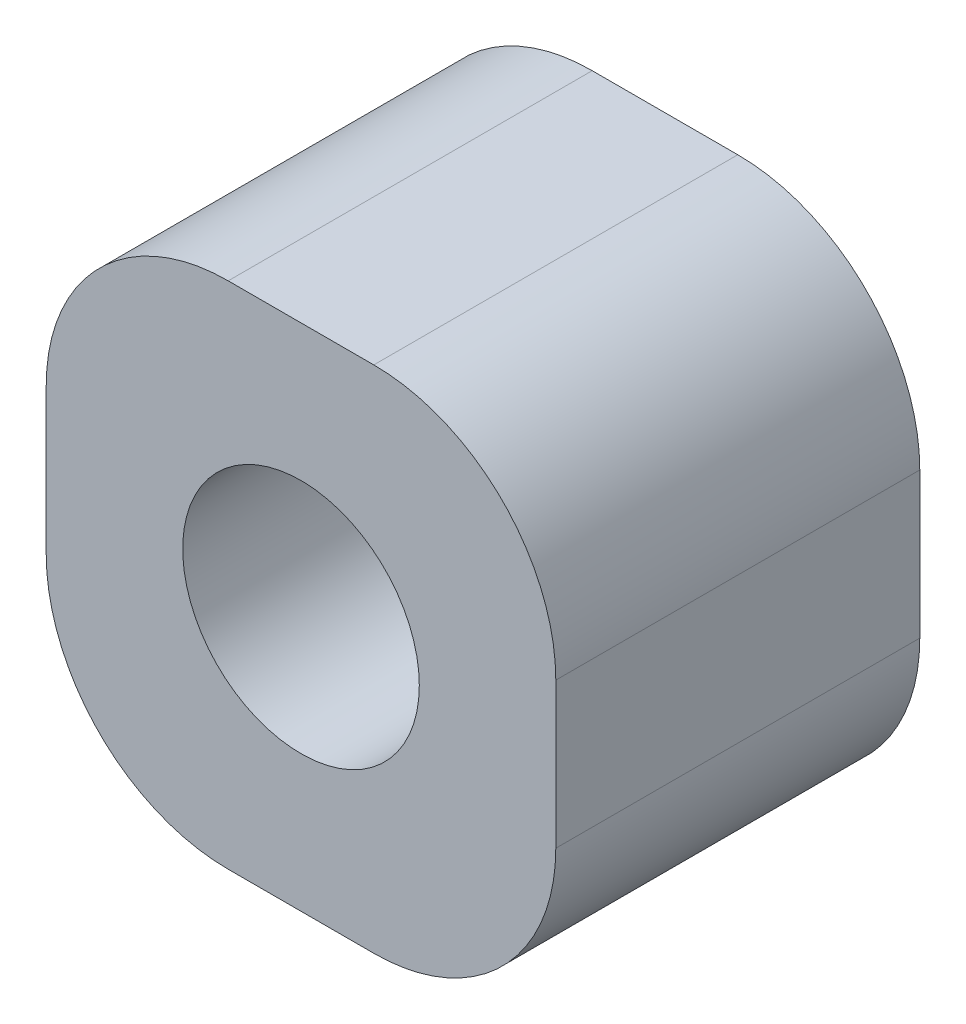
ISO-10303-21;
HEADER;
FILE_DESCRIPTION(('STEP AP214'),'2;1');
FILE_NAME('part.step','',(''),(''),'','','');
FILE_SCHEMA(('AUTOMOTIVE_DESIGN { 1 0 10303 214 1 1 1 1 }'));
ENDSEC;
DATA;
#1=APPLICATION_CONTEXT('core data for automotive mechanical design processes');
#2=APPLICATION_PROTOCOL_DEFINITION('international standard','automotive_design',2000,#1);
#3=PRODUCT_CONTEXT('',#1,'mechanical');
#4=PRODUCT('Part','Part','',(#3));
#5=PRODUCT_RELATED_PRODUCT_CATEGORY('part','',(#4));
#6=PRODUCT_DEFINITION_FORMATION('','',#4);
#7=PRODUCT_DEFINITION_CONTEXT('part definition',#1,'design');
#8=PRODUCT_DEFINITION('design','',#6,#7);
#9=PRODUCT_DEFINITION_SHAPE('','',#8);
#10=(LENGTH_UNIT() NAMED_UNIT(*) SI_UNIT(.MILLI.,.METRE.));
#11=(NAMED_UNIT(*) PLANE_ANGLE_UNIT() SI_UNIT($,.RADIAN.));
#12=(NAMED_UNIT(*) SI_UNIT($,.STERADIAN.) SOLID_ANGLE_UNIT());
#13=UNCERTAINTY_MEASURE_WITH_UNIT(LENGTH_MEASURE(1.E-05),#10,'distance_accuracy_value','');
#14=(GEOMETRIC_REPRESENTATION_CONTEXT(3) GLOBAL_UNCERTAINTY_ASSIGNED_CONTEXT((#13)) GLOBAL_UNIT_ASSIGNED_CONTEXT((#10,
#11,#12)) REPRESENTATION_CONTEXT('',''));
#15=CARTESIAN_POINT('',(0.,0.,0.));
#16=DIRECTION('',(0.,0.,1.));
#17=DIRECTION('',(1.,0.,0.));
#18=AXIS2_PLACEMENT_3D('',#15,#16,#17);
#19=CARTESIAN_POINT('',(0.,0.,10.));
#20=DIRECTION('',(0.,0.,-1.));
#21=DIRECTION('',(-1.,0.,0.));
#22=AXIS2_PLACEMENT_3D('',#19,#20,#21);
#23=PLANE('',#22);
#24=DIRECTION('',(0.,1.,0.));
#25=VECTOR('',#24,1.);
#26=CARTESIAN_POINT('',(14.,0.,10.));
#27=LINE('',#26,#25);
#28=CARTESIAN_POINT('',(14.,5.,10.));
#29=VERTEX_POINT('',#28);
#30=CARTESIAN_POINT('',(14.,9.,10.));
#31=VERTEX_POINT('',#30);
#32=EDGE_CURVE('E175',#29,#31,#27,.T.);
#33=ORIENTED_EDGE('',*,*,#32,.T.);
#34=CARTESIAN_POINT('',(9.,9.,10.));
#35=DIRECTION('',(0.,0.,-1.));
#36=DIRECTION('',(-1.,0.,0.));
#37=AXIS2_PLACEMENT_3D('',#34,#35,#36);
#38=CIRCLE('',#37,5.);
#39=CARTESIAN_POINT('',(9.,14.,10.));
#40=VERTEX_POINT('',#39);
#41=EDGE_CURVE('E152',#31,#40,#38,.F.);
#42=ORIENTED_EDGE('',*,*,#41,.T.);
#43=DIRECTION('',(-1.,0.,0.));
#44=VECTOR('',#43,1.);
#45=CARTESIAN_POINT('',(0.,14.,10.));
#46=LINE('',#45,#44);
#47=CARTESIAN_POINT('',(5.,14.,10.));
#48=VERTEX_POINT('',#47);
#49=EDGE_CURVE('E123',#40,#48,#46,.T.);
#50=ORIENTED_EDGE('',*,*,#49,.T.);
#51=CARTESIAN_POINT('',(5.,9.,10.));
#52=DIRECTION('',(0.,0.,-1.));
#53=DIRECTION('',(-1.,0.,0.));
#54=AXIS2_PLACEMENT_3D('',#51,#52,#53);
#55=CIRCLE('',#54,5.);
#56=CARTESIAN_POINT('',(0.,9.,10.));
#57=VERTEX_POINT('',#56);
#58=EDGE_CURVE('E147',#48,#57,#55,.F.);
#59=ORIENTED_EDGE('',*,*,#58,.T.);
#60=DIRECTION('',(0.,-1.,0.));
#61=VECTOR('',#60,1.);
#62=CARTESIAN_POINT('',(0.,0.,10.));
#63=LINE('',#62,#61);
#64=CARTESIAN_POINT('',(0.,5.,10.));
#65=VERTEX_POINT('',#64);
#66=EDGE_CURVE('E130',#57,#65,#63,.T.);
#67=ORIENTED_EDGE('',*,*,#66,.T.);
#68=CARTESIAN_POINT('',(5.,5.,10.));
#69=DIRECTION('',(0.,0.,-1.));
#70=DIRECTION('',(-1.,0.,0.));
#71=AXIS2_PLACEMENT_3D('',#68,#69,#70);
#72=CIRCLE('',#71,5.);
#73=CARTESIAN_POINT('',(5.,0.,10.));
#74=VERTEX_POINT('',#73);
#75=EDGE_CURVE('E59',#65,#74,#72,.F.);
#76=ORIENTED_EDGE('',*,*,#75,.T.);
#77=DIRECTION('',(1.,0.,0.));
#78=VECTOR('',#77,1.);
#79=CARTESIAN_POINT('',(0.,0.,10.));
#80=LINE('',#79,#78);
#81=CARTESIAN_POINT('',(9.,0.,10.));
#82=VERTEX_POINT('',#81);
#83=EDGE_CURVE('E133',#74,#82,#80,.T.);
#84=ORIENTED_EDGE('',*,*,#83,.T.);
#85=CARTESIAN_POINT('',(9.,5.,10.));
#86=DIRECTION('',(0.,0.,-1.));
#87=DIRECTION('',(-1.,0.,0.));
#88=AXIS2_PLACEMENT_3D('',#85,#86,#87);
#89=CIRCLE('',#88,5.);
#90=EDGE_CURVE('E150',#82,#29,#89,.F.);
#91=ORIENTED_EDGE('',*,*,#90,.T.);
#92=EDGE_LOOP('',(#33,#42,#50,#59,#67,#76,#84,#91));
#93=FACE_BOUND('',#92,.T.);
#94=CARTESIAN_POINT('',(7.,7.,10.));
#95=DIRECTION('',(0.,0.,1.));
#96=DIRECTION('',(1.,0.,0.));
#97=AXIS2_PLACEMENT_3D('',#94,#95,#96);
#98=CIRCLE('',#97,3.25);
#99=CARTESIAN_POINT('',(10.25,7.,10.));
#100=VERTEX_POINT('',#99);
#101=EDGE_CURVE('E168',#100,#100,#98,.T.);
#102=ORIENTED_EDGE('',*,*,#101,.F.);
#103=EDGE_LOOP('',(#102));
#104=FACE_BOUND('',#103,.T.);
#105=ADVANCED_FACE('F37',(#93,#104),#23,.F.);
#106=CARTESIAN_POINT('',(0.,0.,0.));
#107=DIRECTION('',(0.,0.,-1.));
#108=DIRECTION('',(-1.,0.,0.));
#109=AXIS2_PLACEMENT_3D('',#106,#107,#108);
#110=PLANE('',#109);
#111=DIRECTION('',(-1.,0.,0.));
#112=VECTOR('',#111,1.);
#113=CARTESIAN_POINT('',(0.,14.,0.));
#114=LINE('',#113,#112);
#115=CARTESIAN_POINT('',(9.,14.,0.));
#116=VERTEX_POINT('',#115);
#117=CARTESIAN_POINT('',(5.,14.,0.));
#118=VERTEX_POINT('',#117);
#119=EDGE_CURVE('E120',#116,#118,#114,.T.);
#120=ORIENTED_EDGE('',*,*,#119,.F.);
#121=CARTESIAN_POINT('',(9.,9.,0.));
#122=DIRECTION('',(0.,0.,-1.));
#123=DIRECTION('',(-1.,0.,0.));
#124=AXIS2_PLACEMENT_3D('',#121,#122,#123);
#125=CIRCLE('',#124,5.);
#126=CARTESIAN_POINT('',(14.,9.,0.));
#127=VERTEX_POINT('',#126);
#128=EDGE_CURVE('E103',#116,#127,#125,.T.);
#129=ORIENTED_EDGE('',*,*,#128,.T.);
#130=DIRECTION('',(0.,1.,0.));
#131=VECTOR('',#130,1.);
#132=CARTESIAN_POINT('',(14.,0.,0.));
#133=LINE('',#132,#131);
#134=CARTESIAN_POINT('',(14.,5.,0.));
#135=VERTEX_POINT('',#134);
#136=EDGE_CURVE('E131',#135,#127,#133,.T.);
#137=ORIENTED_EDGE('',*,*,#136,.F.);
#138=CARTESIAN_POINT('',(9.,5.,0.));
#139=DIRECTION('',(0.,0.,-1.));
#140=DIRECTION('',(-1.,0.,0.));
#141=AXIS2_PLACEMENT_3D('',#138,#139,#140);
#142=CIRCLE('',#141,5.);
#143=CARTESIAN_POINT('',(9.,0.,0.));
#144=VERTEX_POINT('',#143);
#145=EDGE_CURVE('E114',#135,#144,#142,.T.);
#146=ORIENTED_EDGE('',*,*,#145,.T.);
#147=DIRECTION('',(1.,0.,0.));
#148=VECTOR('',#147,1.);
#149=CARTESIAN_POINT('',(0.,0.,0.));
#150=LINE('',#149,#148);
#151=CARTESIAN_POINT('',(5.,0.,0.));
#152=VERTEX_POINT('',#151);
#153=EDGE_CURVE('E135',#152,#144,#150,.T.);
#154=ORIENTED_EDGE('',*,*,#153,.F.);
#155=CARTESIAN_POINT('',(5.,5.,0.));
#156=DIRECTION('',(0.,0.,-1.));
#157=DIRECTION('',(-1.,0.,0.));
#158=AXIS2_PLACEMENT_3D('',#155,#156,#157);
#159=CIRCLE('',#158,5.);
#160=CARTESIAN_POINT('',(0.,5.,0.));
#161=VERTEX_POINT('',#160);
#162=EDGE_CURVE('E141',#152,#161,#159,.T.);
#163=ORIENTED_EDGE('',*,*,#162,.T.);
#164=DIRECTION('',(0.,-1.,0.));
#165=VECTOR('',#164,1.);
#166=CARTESIAN_POINT('',(0.,0.,0.));
#167=LINE('',#166,#165);
#168=CARTESIAN_POINT('',(0.,9.,0.));
#169=VERTEX_POINT('',#168);
#170=EDGE_CURVE('E163',#169,#161,#167,.T.);
#171=ORIENTED_EDGE('',*,*,#170,.F.);
#172=CARTESIAN_POINT('',(5.,9.,0.));
#173=DIRECTION('',(0.,0.,-1.));
#174=DIRECTION('',(-1.,0.,0.));
#175=AXIS2_PLACEMENT_3D('',#172,#173,#174);
#176=CIRCLE('',#175,5.);
#177=EDGE_CURVE('E124',#169,#118,#176,.T.);
#178=ORIENTED_EDGE('',*,*,#177,.T.);
#179=EDGE_LOOP('',(#120,#129,#137,#146,#154,#163,#171,#178));
#180=FACE_BOUND('',#179,.T.);
#181=CARTESIAN_POINT('',(7.,7.,0.));
#182=DIRECTION('',(0.,0.,1.));
#183=DIRECTION('',(1.,0.,0.));
#184=AXIS2_PLACEMENT_3D('',#181,#182,#183);
#185=CIRCLE('',#184,3.25);
#186=CARTESIAN_POINT('',(10.25,7.,0.));
#187=VERTEX_POINT('',#186);
#188=EDGE_CURVE('E171',#187,#187,#185,.T.);
#189=ORIENTED_EDGE('',*,*,#188,.T.);
#190=EDGE_LOOP('',(#189));
#191=FACE_BOUND('',#190,.T.);
#192=ADVANCED_FACE('F127',(#180,#191),#110,.T.);
#193=CARTESIAN_POINT('',(0.,0.,10.));
#194=DIRECTION('',(1.,0.,0.));
#195=DIRECTION('',(0.,0.,-1.));
#196=AXIS2_PLACEMENT_3D('',#193,#194,#195);
#197=PLANE('',#196);
#198=ORIENTED_EDGE('',*,*,#170,.T.);
#199=DIRECTION('',(0.,0.,-1.));
#200=VECTOR('',#199,1.);
#201=CARTESIAN_POINT('',(0.,5.,10.));
#202=LINE('',#201,#200);
#203=EDGE_CURVE('E11',#161,#65,#202,.F.);
#204=ORIENTED_EDGE('',*,*,#203,.T.);
#205=ORIENTED_EDGE('',*,*,#66,.F.);
#206=DIRECTION('',(0.,0.,-1.));
#207=VECTOR('',#206,1.);
#208=CARTESIAN_POINT('',(0.,9.,10.));
#209=LINE('',#208,#207);
#210=EDGE_CURVE('E45',#57,#169,#209,.T.);
#211=ORIENTED_EDGE('',*,*,#210,.T.);
#212=EDGE_LOOP('',(#198,#204,#205,#211));
#213=FACE_BOUND('',#212,.T.);
#214=ADVANCED_FACE('F162',(#213),#197,.F.);
#215=CARTESIAN_POINT('',(0.,0.,10.));
#216=DIRECTION('',(0.,1.,0.));
#217=DIRECTION('',(0.,0.,1.));
#218=AXIS2_PLACEMENT_3D('',#215,#216,#217);
#219=PLANE('',#218);
#220=ORIENTED_EDGE('',*,*,#153,.T.);
#221=DIRECTION('',(0.,0.,-1.));
#222=VECTOR('',#221,1.);
#223=CARTESIAN_POINT('',(9.,0.,10.));
#224=LINE('',#223,#222);
#225=EDGE_CURVE('E52',#144,#82,#224,.F.);
#226=ORIENTED_EDGE('',*,*,#225,.T.);
#227=ORIENTED_EDGE('',*,*,#83,.F.);
#228=DIRECTION('',(0.,0.,-1.));
#229=VECTOR('',#228,1.);
#230=CARTESIAN_POINT('',(5.,0.,10.));
#231=LINE('',#230,#229);
#232=EDGE_CURVE('E154',#74,#152,#231,.T.);
#233=ORIENTED_EDGE('',*,*,#232,.T.);
#234=EDGE_LOOP('',(#220,#226,#227,#233));
#235=FACE_BOUND('',#234,.T.);
#236=ADVANCED_FACE('F204',(#235),#219,.F.);
#237=CARTESIAN_POINT('',(14.,0.,10.));
#238=DIRECTION('',(-1.,0.,0.));
#239=DIRECTION('',(0.,0.,1.));
#240=AXIS2_PLACEMENT_3D('',#237,#238,#239);
#241=PLANE('',#240);
#242=ORIENTED_EDGE('',*,*,#136,.T.);
#243=DIRECTION('',(0.,0.,-1.));
#244=VECTOR('',#243,1.);
#245=CARTESIAN_POINT('',(14.,9.,10.));
#246=LINE('',#245,#244);
#247=EDGE_CURVE('E108',#127,#31,#246,.F.);
#248=ORIENTED_EDGE('',*,*,#247,.T.);
#249=ORIENTED_EDGE('',*,*,#32,.F.);
#250=DIRECTION('',(0.,0.,-1.));
#251=VECTOR('',#250,1.);
#252=CARTESIAN_POINT('',(14.,5.,10.));
#253=LINE('',#252,#251);
#254=EDGE_CURVE('E113',#29,#135,#253,.T.);
#255=ORIENTED_EDGE('',*,*,#254,.T.);
#256=EDGE_LOOP('',(#242,#248,#249,#255));
#257=FACE_BOUND('',#256,.T.);
#258=ADVANCED_FACE('F192',(#257),#241,.F.);
#259=CARTESIAN_POINT('',(0.,14.,10.));
#260=DIRECTION('',(0.,-1.,0.));
#261=DIRECTION('',(0.,0.,-1.));
#262=AXIS2_PLACEMENT_3D('',#259,#260,#261);
#263=PLANE('',#262);
#264=ORIENTED_EDGE('',*,*,#49,.F.);
#265=DIRECTION('',(0.,0.,-1.));
#266=VECTOR('',#265,1.);
#267=CARTESIAN_POINT('',(9.,14.,10.));
#268=LINE('',#267,#266);
#269=EDGE_CURVE('E107',#40,#116,#268,.T.);
#270=ORIENTED_EDGE('',*,*,#269,.T.);
#271=ORIENTED_EDGE('',*,*,#119,.T.);
#272=DIRECTION('',(0.,0.,-1.));
#273=VECTOR('',#272,1.);
#274=CARTESIAN_POINT('',(5.,14.,10.));
#275=LINE('',#274,#273);
#276=EDGE_CURVE('E125',#118,#48,#275,.F.);
#277=ORIENTED_EDGE('',*,*,#276,.T.);
#278=EDGE_LOOP('',(#264,#270,#271,#277));
#279=FACE_BOUND('',#278,.T.);
#280=ADVANCED_FACE('F119',(#279),#263,.F.);
#281=CARTESIAN_POINT('',(7.,7.,10.));
#282=DIRECTION('',(0.,0.,-1.));
#283=DIRECTION('',(-1.,0.,0.));
#284=AXIS2_PLACEMENT_3D('',#281,#282,#283);
#285=CYLINDRICAL_SURFACE('',#284,3.25);
#286=ORIENTED_EDGE('',*,*,#101,.T.);
#287=EDGE_LOOP('',(#286));
#288=FACE_BOUND('',#287,.T.);
#289=ORIENTED_EDGE('',*,*,#188,.F.);
#290=EDGE_LOOP('',(#289));
#291=FACE_BOUND('',#290,.T.);
#292=ADVANCED_FACE('F182',(#288,#291),#285,.F.);
#293=CARTESIAN_POINT('',(9.,9.,10.));
#294=DIRECTION('',(0.,0.,-1.));
#295=DIRECTION('',(-1.,0.,0.));
#296=AXIS2_PLACEMENT_3D('',#293,#294,#295);
#297=CYLINDRICAL_SURFACE('',#296,5.);
#298=ORIENTED_EDGE('',*,*,#41,.F.);
#299=ORIENTED_EDGE('',*,*,#247,.F.);
#300=ORIENTED_EDGE('',*,*,#128,.F.);
#301=ORIENTED_EDGE('',*,*,#269,.F.);
#302=EDGE_LOOP('',(#298,#299,#300,#301));
#303=FACE_BOUND('',#302,.T.);
#304=ADVANCED_FACE('F106',(#303),#297,.T.);
#305=CARTESIAN_POINT('',(9.,5.,10.));
#306=DIRECTION('',(0.,0.,-1.));
#307=DIRECTION('',(-1.,0.,0.));
#308=AXIS2_PLACEMENT_3D('',#305,#306,#307);
#309=CYLINDRICAL_SURFACE('',#308,5.);
#310=ORIENTED_EDGE('',*,*,#90,.F.);
#311=ORIENTED_EDGE('',*,*,#225,.F.);
#312=ORIENTED_EDGE('',*,*,#145,.F.);
#313=ORIENTED_EDGE('',*,*,#254,.F.);
#314=EDGE_LOOP('',(#310,#311,#312,#313));
#315=FACE_BOUND('',#314,.T.);
#316=ADVANCED_FACE('F190',(#315),#309,.T.);
#317=CARTESIAN_POINT('',(5.,5.,10.));
#318=DIRECTION('',(0.,0.,-1.));
#319=DIRECTION('',(-1.,0.,0.));
#320=AXIS2_PLACEMENT_3D('',#317,#318,#319);
#321=CYLINDRICAL_SURFACE('',#320,5.);
#322=ORIENTED_EDGE('',*,*,#75,.F.);
#323=ORIENTED_EDGE('',*,*,#203,.F.);
#324=ORIENTED_EDGE('',*,*,#162,.F.);
#325=ORIENTED_EDGE('',*,*,#232,.F.);
#326=EDGE_LOOP('',(#322,#323,#324,#325));
#327=FACE_BOUND('',#326,.T.);
#328=ADVANCED_FACE('F211',(#327),#321,.T.);
#329=CARTESIAN_POINT('',(5.,9.,10.));
#330=DIRECTION('',(0.,0.,-1.));
#331=DIRECTION('',(-1.,0.,0.));
#332=AXIS2_PLACEMENT_3D('',#329,#330,#331);
#333=CYLINDRICAL_SURFACE('',#332,5.);
#334=ORIENTED_EDGE('',*,*,#58,.F.);
#335=ORIENTED_EDGE('',*,*,#276,.F.);
#336=ORIENTED_EDGE('',*,*,#177,.F.);
#337=ORIENTED_EDGE('',*,*,#210,.F.);
#338=EDGE_LOOP('',(#334,#335,#336,#337));
#339=FACE_BOUND('',#338,.T.);
#340=ADVANCED_FACE('F39',(#339),#333,.T.);
#341=CLOSED_SHELL('',(#105,#192,#214,#236,#258,#280,#292,#304,#316,#328,#340));
#342=MANIFOLD_SOLID_BREP('B2',#341);
#343=ADVANCED_BREP_SHAPE_REPRESENTATION('',(#18,#342),#14);
#344=SHAPE_DEFINITION_REPRESENTATION(#9,#343);
ENDSEC;
END-ISO-10303-21;
